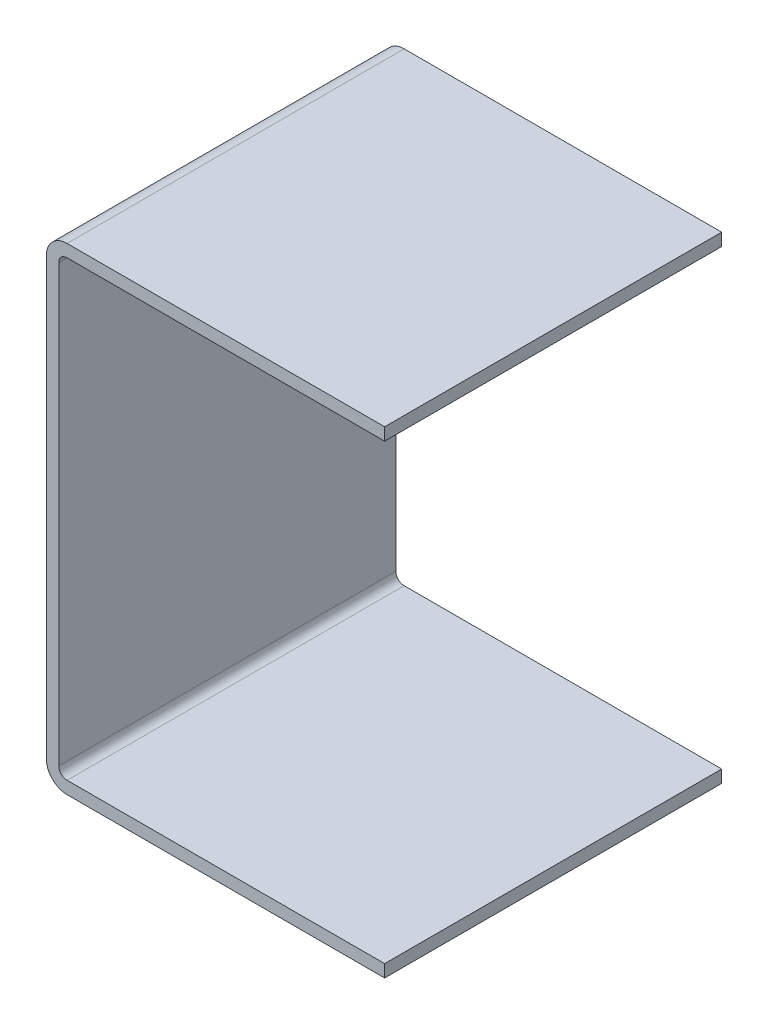
ISO-10303-21;
HEADER;
FILE_DESCRIPTION(('STEP AP214'),'2;1');
FILE_NAME('part.step','',(''),(''),'','','');
FILE_SCHEMA(('AUTOMOTIVE_DESIGN { 1 0 10303 214 1 1 1 1 }'));
ENDSEC;
DATA;
#1=APPLICATION_CONTEXT('core data for automotive mechanical design processes');
#2=APPLICATION_PROTOCOL_DEFINITION('international standard','automotive_design',2000,#1);
#3=PRODUCT_CONTEXT('',#1,'mechanical');
#4=PRODUCT('Part','Part','',(#3));
#5=PRODUCT_RELATED_PRODUCT_CATEGORY('part','',(#4));
#6=PRODUCT_DEFINITION_FORMATION('','',#4);
#7=PRODUCT_DEFINITION_CONTEXT('part definition',#1,'design');
#8=PRODUCT_DEFINITION('design','',#6,#7);
#9=PRODUCT_DEFINITION_SHAPE('','',#8);
#10=(LENGTH_UNIT() NAMED_UNIT(*) SI_UNIT(.MILLI.,.METRE.));
#11=(NAMED_UNIT(*) PLANE_ANGLE_UNIT() SI_UNIT($,.RADIAN.));
#12=(NAMED_UNIT(*) SI_UNIT($,.STERADIAN.) SOLID_ANGLE_UNIT());
#13=UNCERTAINTY_MEASURE_WITH_UNIT(LENGTH_MEASURE(1.E-05),#10,'distance_accuracy_value','');
#14=(GEOMETRIC_REPRESENTATION_CONTEXT(3) GLOBAL_UNCERTAINTY_ASSIGNED_CONTEXT((#13)) GLOBAL_UNIT_ASSIGNED_CONTEXT((#10,
#11,#12)) REPRESENTATION_CONTEXT('',''));
#15=CARTESIAN_POINT('',(0.,0.,0.));
#16=DIRECTION('',(0.,0.,1.));
#17=DIRECTION('',(1.,0.,0.));
#18=AXIS2_PLACEMENT_3D('',#15,#16,#17);
#19=CARTESIAN_POINT('',(-42.5750778056485,-19.4301560758083,40.6));
#20=DIRECTION('',(0.,0.,-1.));
#21=DIRECTION('',(-1.,0.,0.));
#22=AXIS2_PLACEMENT_3D('',#19,#20,#21);
#23=CYLINDRICAL_SURFACE('',#22,5.);
#24=CARTESIAN_POINT('',(-42.5750778056485,-19.4301560758083,-40.6));
#25=DIRECTION('',(0.,0.,1.));
#26=DIRECTION('',(1.,0.,0.));
#27=AXIS2_PLACEMENT_3D('',#24,#25,#26);
#28=CIRCLE('',#27,5.);
#29=CARTESIAN_POINT('',(-47.5750778056485,-19.4301560758082,-40.6));
#30=VERTEX_POINT('',#29);
#31=CARTESIAN_POINT('',(-42.5750778056484,-24.4301560758083,-40.6));
#32=VERTEX_POINT('',#31);
#33=EDGE_CURVE('E151',#30,#32,#28,.T.);
#34=ORIENTED_EDGE('',*,*,#33,.T.);
#35=DIRECTION('',(0.,0.,-1.));
#36=VECTOR('',#35,1.);
#37=CARTESIAN_POINT('',(-42.5750778056484,-24.4301560758083,40.6));
#38=LINE('',#37,#36);
#39=CARTESIAN_POINT('',(-42.5750778056484,-24.4301560758083,40.6));
#40=VERTEX_POINT('',#39);
#41=EDGE_CURVE('E11',#40,#32,#38,.T.);
#42=ORIENTED_EDGE('',*,*,#41,.F.);
#43=CARTESIAN_POINT('',(-42.5750778056485,-19.4301560758083,40.6));
#44=DIRECTION('',(0.,0.,1.));
#45=DIRECTION('',(1.,0.,0.));
#46=AXIS2_PLACEMENT_3D('',#43,#44,#45);
#47=CIRCLE('',#46,5.);
#48=CARTESIAN_POINT('',(-47.5750778056485,-19.4301560758082,40.6));
#49=VERTEX_POINT('',#48);
#50=EDGE_CURVE('E173',#49,#40,#47,.T.);
#51=ORIENTED_EDGE('',*,*,#50,.F.);
#52=DIRECTION('',(0.,0.,-1.));
#53=VECTOR('',#52,1.);
#54=CARTESIAN_POINT('',(-47.5750778056485,-19.4301560758082,40.6));
#55=LINE('',#54,#53);
#56=EDGE_CURVE('E147',#49,#30,#55,.T.);
#57=ORIENTED_EDGE('',*,*,#56,.T.);
#58=EDGE_LOOP('',(#34,#42,#51,#57));
#59=FACE_BOUND('',#58,.T.);
#60=ADVANCED_FACE('F31',(#59),#23,.T.);
#61=CARTESIAN_POINT('',(33.9249221943515,-24.4301560758083,40.6));
#62=DIRECTION('',(0.,1.,0.));
#63=DIRECTION('',(-1.,0.,0.));
#64=AXIS2_PLACEMENT_3D('',#61,#62,#63);
#65=PLANE('',#64);
#66=DIRECTION('',(1.,0.,0.));
#67=VECTOR('',#66,1.);
#68=CARTESIAN_POINT('',(33.9249221943515,-24.4301560758083,-40.6));
#69=LINE('',#68,#67);
#70=CARTESIAN_POINT('',(33.9249221943515,-24.4301560758083,-40.6));
#71=VERTEX_POINT('',#70);
#72=EDGE_CURVE('E154',#32,#71,#69,.T.);
#73=ORIENTED_EDGE('',*,*,#72,.T.);
#74=DIRECTION('',(0.,0.,-1.));
#75=VECTOR('',#74,1.);
#76=CARTESIAN_POINT('',(33.9249221943515,-24.4301560758083,40.6));
#77=LINE('',#76,#75);
#78=CARTESIAN_POINT('',(33.9249221943515,-24.4301560758083,40.6));
#79=VERTEX_POINT('',#78);
#80=EDGE_CURVE('E39',#79,#71,#77,.T.);
#81=ORIENTED_EDGE('',*,*,#80,.F.);
#82=DIRECTION('',(1.,0.,0.));
#83=VECTOR('',#82,1.);
#84=CARTESIAN_POINT('',(33.9249221943515,-24.4301560758083,40.6));
#85=LINE('',#84,#83);
#86=EDGE_CURVE('E102',#40,#79,#85,.T.);
#87=ORIENTED_EDGE('',*,*,#86,.F.);
#88=ORIENTED_EDGE('',*,*,#41,.T.);
#89=EDGE_LOOP('',(#73,#81,#87,#88));
#90=FACE_BOUND('',#89,.T.);
#91=ADVANCED_FACE('F251',(#90),#65,.F.);
#92=CARTESIAN_POINT('',(33.9249221943515,-21.4301560758083,40.6));
#93=DIRECTION('',(-1.,0.,0.));
#94=DIRECTION('',(0.,0.,1.));
#95=AXIS2_PLACEMENT_3D('',#92,#93,#94);
#96=PLANE('',#95);
#97=DIRECTION('',(0.,1.,0.));
#98=VECTOR('',#97,1.);
#99=CARTESIAN_POINT('',(33.9249221943515,-21.4301560758083,-40.6));
#100=LINE('',#99,#98);
#101=CARTESIAN_POINT('',(33.9249221943515,-21.4301560758083,-40.6));
#102=VERTEX_POINT('',#101);
#103=EDGE_CURVE('E156',#71,#102,#100,.T.);
#104=ORIENTED_EDGE('',*,*,#103,.T.);
#105=DIRECTION('',(0.,0.,-1.));
#106=VECTOR('',#105,1.);
#107=CARTESIAN_POINT('',(33.9249221943515,-21.4301560758083,40.6));
#108=LINE('',#107,#106);
#109=CARTESIAN_POINT('',(33.9249221943515,-21.4301560758083,40.6));
#110=VERTEX_POINT('',#109);
#111=EDGE_CURVE('E192',#110,#102,#108,.T.);
#112=ORIENTED_EDGE('',*,*,#111,.F.);
#113=DIRECTION('',(0.,1.,0.));
#114=VECTOR('',#113,1.);
#115=CARTESIAN_POINT('',(33.9249221943515,-21.4301560758083,40.6));
#116=LINE('',#115,#114);
#117=EDGE_CURVE('E200',#79,#110,#116,.T.);
#118=ORIENTED_EDGE('',*,*,#117,.F.);
#119=ORIENTED_EDGE('',*,*,#80,.T.);
#120=EDGE_LOOP('',(#104,#112,#118,#119));
#121=FACE_BOUND('',#120,.T.);
#122=ADVANCED_FACE('F198',(#121),#96,.F.);
#123=CARTESIAN_POINT('',(-42.5750778056484,-21.4301560758082,40.6));
#124=DIRECTION('',(0.,-1.,0.));
#125=DIRECTION('',(1.,0.,0.));
#126=AXIS2_PLACEMENT_3D('',#123,#124,#125);
#127=PLANE('',#126);
#128=DIRECTION('',(-1.,0.,0.));
#129=VECTOR('',#128,1.);
#130=CARTESIAN_POINT('',(-42.5750778056484,-21.4301560758082,-40.6));
#131=LINE('',#130,#129);
#132=CARTESIAN_POINT('',(-42.5750778056484,-21.4301560758082,-40.6));
#133=VERTEX_POINT('',#132);
#134=EDGE_CURVE('E158',#102,#133,#131,.T.);
#135=ORIENTED_EDGE('',*,*,#134,.T.);
#136=DIRECTION('',(0.,0.,-1.));
#137=VECTOR('',#136,1.);
#138=CARTESIAN_POINT('',(-42.5750778056484,-21.4301560758082,40.6));
#139=LINE('',#138,#137);
#140=CARTESIAN_POINT('',(-42.5750778056484,-21.4301560758082,40.6));
#141=VERTEX_POINT('',#140);
#142=EDGE_CURVE('E189',#141,#133,#139,.T.);
#143=ORIENTED_EDGE('',*,*,#142,.F.);
#144=DIRECTION('',(-1.,0.,0.));
#145=VECTOR('',#144,1.);
#146=CARTESIAN_POINT('',(-42.5750778056484,-21.4301560758082,40.6));
#147=LINE('',#146,#145);
#148=EDGE_CURVE('E218',#110,#141,#147,.T.);
#149=ORIENTED_EDGE('',*,*,#148,.F.);
#150=ORIENTED_EDGE('',*,*,#111,.T.);
#151=EDGE_LOOP('',(#135,#143,#149,#150));
#152=FACE_BOUND('',#151,.T.);
#153=ADVANCED_FACE('F209',(#152),#127,.F.);
#154=CARTESIAN_POINT('',(-42.5750778056485,-19.4301560758082,40.6));
#155=DIRECTION('',(0.,0.,-1.));
#156=DIRECTION('',(-1.,0.,0.));
#157=AXIS2_PLACEMENT_3D('',#154,#155,#156);
#158=CYLINDRICAL_SURFACE('',#157,2.);
#159=CARTESIAN_POINT('',(-42.5750778056485,-19.4301560758082,-40.6));
#160=DIRECTION('',(0.,0.,-1.));
#161=DIRECTION('',(1.,0.,0.));
#162=AXIS2_PLACEMENT_3D('',#159,#160,#161);
#163=CIRCLE('',#162,2.);
#164=CARTESIAN_POINT('',(-44.5750778056485,-19.4301560758082,-40.6));
#165=VERTEX_POINT('',#164);
#166=EDGE_CURVE('E160',#133,#165,#163,.T.);
#167=ORIENTED_EDGE('',*,*,#166,.T.);
#168=DIRECTION('',(0.,0.,-1.));
#169=VECTOR('',#168,1.);
#170=CARTESIAN_POINT('',(-44.5750778056485,-19.4301560758082,40.6));
#171=LINE('',#170,#169);
#172=CARTESIAN_POINT('',(-44.5750778056485,-19.4301560758082,40.6));
#173=VERTEX_POINT('',#172);
#174=EDGE_CURVE('E186',#173,#165,#171,.T.);
#175=ORIENTED_EDGE('',*,*,#174,.F.);
#176=CARTESIAN_POINT('',(-42.5750778056485,-19.4301560758082,40.6));
#177=DIRECTION('',(0.,0.,-1.));
#178=DIRECTION('',(1.,0.,0.));
#179=AXIS2_PLACEMENT_3D('',#176,#177,#178);
#180=CIRCLE('',#179,2.);
#181=EDGE_CURVE('E215',#141,#173,#180,.T.);
#182=ORIENTED_EDGE('',*,*,#181,.F.);
#183=ORIENTED_EDGE('',*,*,#142,.T.);
#184=EDGE_LOOP('',(#167,#175,#182,#183));
#185=FACE_BOUND('',#184,.T.);
#186=ADVANCED_FACE('F213',(#185),#158,.F.);
#187=CARTESIAN_POINT('',(-44.5750778056485,85.5698439241917,40.6));
#188=DIRECTION('',(-1.,0.,0.));
#189=DIRECTION('',(0.,-1.,0.));
#190=AXIS2_PLACEMENT_3D('',#187,#188,#189);
#191=PLANE('',#190);
#192=DIRECTION('',(0.,1.,0.));
#193=VECTOR('',#192,1.);
#194=CARTESIAN_POINT('',(-44.5750778056485,85.5698439241917,-40.6));
#195=LINE('',#194,#193);
#196=CARTESIAN_POINT('',(-44.5750778056485,85.5698439241917,-40.6));
#197=VERTEX_POINT('',#196);
#198=EDGE_CURVE('E162',#165,#197,#195,.T.);
#199=ORIENTED_EDGE('',*,*,#198,.T.);
#200=DIRECTION('',(0.,0.,-1.));
#201=VECTOR('',#200,1.);
#202=CARTESIAN_POINT('',(-44.5750778056485,85.5698439241917,40.6));
#203=LINE('',#202,#201);
#204=CARTESIAN_POINT('',(-44.5750778056485,85.5698439241917,40.6));
#205=VERTEX_POINT('',#204);
#206=EDGE_CURVE('E183',#205,#197,#203,.T.);
#207=ORIENTED_EDGE('',*,*,#206,.F.);
#208=DIRECTION('',(0.,1.,0.));
#209=VECTOR('',#208,1.);
#210=CARTESIAN_POINT('',(-44.5750778056485,85.5698439241917,40.6));
#211=LINE('',#210,#209);
#212=EDGE_CURVE('E217',#173,#205,#211,.T.);
#213=ORIENTED_EDGE('',*,*,#212,.F.);
#214=ORIENTED_EDGE('',*,*,#174,.T.);
#215=EDGE_LOOP('',(#199,#207,#213,#214));
#216=FACE_BOUND('',#215,.T.);
#217=ADVANCED_FACE('F264',(#216),#191,.F.);
#218=CARTESIAN_POINT('',(-42.5750778056485,85.5698439241917,40.6));
#219=DIRECTION('',(0.,0.,-1.));
#220=DIRECTION('',(-1.,0.,0.));
#221=AXIS2_PLACEMENT_3D('',#218,#219,#220);
#222=CYLINDRICAL_SURFACE('',#221,2.);
#223=CARTESIAN_POINT('',(-42.5750778056485,85.5698439241917,-40.6));
#224=DIRECTION('',(0.,0.,-1.));
#225=DIRECTION('',(1.,0.,0.));
#226=AXIS2_PLACEMENT_3D('',#223,#224,#225);
#227=CIRCLE('',#226,2.);
#228=CARTESIAN_POINT('',(-42.5750778056485,87.5698439241917,-40.6));
#229=VERTEX_POINT('',#228);
#230=EDGE_CURVE('E164',#197,#229,#227,.T.);
#231=ORIENTED_EDGE('',*,*,#230,.T.);
#232=DIRECTION('',(0.,0.,-1.));
#233=VECTOR('',#232,1.);
#234=CARTESIAN_POINT('',(-42.5750778056485,87.5698439241917,40.6));
#235=LINE('',#234,#233);
#236=CARTESIAN_POINT('',(-42.5750778056485,87.5698439241917,40.6));
#237=VERTEX_POINT('',#236);
#238=EDGE_CURVE('E180',#237,#229,#235,.T.);
#239=ORIENTED_EDGE('',*,*,#238,.F.);
#240=CARTESIAN_POINT('',(-42.5750778056485,85.5698439241917,40.6));
#241=DIRECTION('',(0.,0.,-1.));
#242=DIRECTION('',(1.,0.,0.));
#243=AXIS2_PLACEMENT_3D('',#240,#241,#242);
#244=CIRCLE('',#243,2.);
#245=EDGE_CURVE('E220',#205,#237,#244,.T.);
#246=ORIENTED_EDGE('',*,*,#245,.F.);
#247=ORIENTED_EDGE('',*,*,#206,.T.);
#248=EDGE_LOOP('',(#231,#239,#246,#247));
#249=FACE_BOUND('',#248,.T.);
#250=ADVANCED_FACE('F267',(#249),#222,.F.);
#251=CARTESIAN_POINT('',(33.9249221943515,87.5698439241917,40.6));
#252=DIRECTION('',(0.,1.,0.));
#253=DIRECTION('',(-1.,0.,0.));
#254=AXIS2_PLACEMENT_3D('',#251,#252,#253);
#255=PLANE('',#254);
#256=DIRECTION('',(1.,0.,0.));
#257=VECTOR('',#256,1.);
#258=CARTESIAN_POINT('',(33.9249221943515,87.5698439241917,-40.6));
#259=LINE('',#258,#257);
#260=CARTESIAN_POINT('',(33.9249221943515,87.5698439241917,-40.6));
#261=VERTEX_POINT('',#260);
#262=EDGE_CURVE('E166',#229,#261,#259,.T.);
#263=ORIENTED_EDGE('',*,*,#262,.T.);
#264=DIRECTION('',(0.,0.,-1.));
#265=VECTOR('',#264,1.);
#266=CARTESIAN_POINT('',(33.9249221943515,87.5698439241917,40.6));
#267=LINE('',#266,#265);
#268=CARTESIAN_POINT('',(33.9249221943515,87.5698439241917,40.6));
#269=VERTEX_POINT('',#268);
#270=EDGE_CURVE('E177',#269,#261,#267,.T.);
#271=ORIENTED_EDGE('',*,*,#270,.F.);
#272=DIRECTION('',(1.,0.,0.));
#273=VECTOR('',#272,1.);
#274=CARTESIAN_POINT('',(33.9249221943515,87.5698439241917,40.6));
#275=LINE('',#274,#273);
#276=EDGE_CURVE('E226',#237,#269,#275,.T.);
#277=ORIENTED_EDGE('',*,*,#276,.F.);
#278=ORIENTED_EDGE('',*,*,#238,.T.);
#279=EDGE_LOOP('',(#263,#271,#277,#278));
#280=FACE_BOUND('',#279,.T.);
#281=ADVANCED_FACE('F232',(#280),#255,.F.);
#282=CARTESIAN_POINT('',(33.9249221943515,90.5698439241917,40.6));
#283=DIRECTION('',(-1.,0.,0.));
#284=DIRECTION('',(0.,0.,1.));
#285=AXIS2_PLACEMENT_3D('',#282,#283,#284);
#286=PLANE('',#285);
#287=DIRECTION('',(0.,1.,0.));
#288=VECTOR('',#287,1.);
#289=CARTESIAN_POINT('',(33.9249221943515,90.5698439241917,-40.6));
#290=LINE('',#289,#288);
#291=CARTESIAN_POINT('',(33.9249221943515,90.5698439241917,-40.6));
#292=VERTEX_POINT('',#291);
#293=EDGE_CURVE('E168',#261,#292,#290,.T.);
#294=ORIENTED_EDGE('',*,*,#293,.T.);
#295=DIRECTION('',(0.,0.,-1.));
#296=VECTOR('',#295,1.);
#297=CARTESIAN_POINT('',(33.9249221943515,90.5698439241917,40.6));
#298=LINE('',#297,#296);
#299=CARTESIAN_POINT('',(33.9249221943515,90.5698439241917,40.6));
#300=VERTEX_POINT('',#299);
#301=EDGE_CURVE('E142',#300,#292,#298,.T.);
#302=ORIENTED_EDGE('',*,*,#301,.F.);
#303=DIRECTION('',(0.,1.,0.));
#304=VECTOR('',#303,1.);
#305=CARTESIAN_POINT('',(33.9249221943515,90.5698439241917,40.6));
#306=LINE('',#305,#304);
#307=EDGE_CURVE('E133',#269,#300,#306,.T.);
#308=ORIENTED_EDGE('',*,*,#307,.F.);
#309=ORIENTED_EDGE('',*,*,#270,.T.);
#310=EDGE_LOOP('',(#294,#302,#308,#309));
#311=FACE_BOUND('',#310,.T.);
#312=ADVANCED_FACE('F236',(#311),#286,.F.);
#313=CARTESIAN_POINT('',(-42.5750778056484,90.5698439241917,40.6));
#314=DIRECTION('',(0.,-1.,0.));
#315=DIRECTION('',(0.,0.,-1.));
#316=AXIS2_PLACEMENT_3D('',#313,#314,#315);
#317=PLANE('',#316);
#318=DIRECTION('',(-1.,0.,0.));
#319=VECTOR('',#318,1.);
#320=CARTESIAN_POINT('',(-42.5750778056484,90.5698439241917,-40.6));
#321=LINE('',#320,#319);
#322=CARTESIAN_POINT('',(-42.5750778056484,90.5698439241917,-40.6));
#323=VERTEX_POINT('',#322);
#324=EDGE_CURVE('E141',#292,#323,#321,.T.);
#325=ORIENTED_EDGE('',*,*,#324,.T.);
#326=DIRECTION('',(0.,0.,-1.));
#327=VECTOR('',#326,1.);
#328=CARTESIAN_POINT('',(-42.5750778056484,90.5698439241917,40.6));
#329=LINE('',#328,#327);
#330=CARTESIAN_POINT('',(-42.5750778056484,90.5698439241917,40.6));
#331=VERTEX_POINT('',#330);
#332=EDGE_CURVE('E138',#331,#323,#329,.T.);
#333=ORIENTED_EDGE('',*,*,#332,.F.);
#334=DIRECTION('',(-1.,0.,0.));
#335=VECTOR('',#334,1.);
#336=CARTESIAN_POINT('',(-42.5750778056484,90.5698439241917,40.6));
#337=LINE('',#336,#335);
#338=EDGE_CURVE('E127',#300,#331,#337,.T.);
#339=ORIENTED_EDGE('',*,*,#338,.F.);
#340=ORIENTED_EDGE('',*,*,#301,.T.);
#341=EDGE_LOOP('',(#325,#333,#339,#340));
#342=FACE_BOUND('',#341,.T.);
#343=ADVANCED_FACE('F139',(#342),#317,.F.);
#344=CARTESIAN_POINT('',(-42.5750778056485,85.5698439241917,40.6));
#345=DIRECTION('',(0.,0.,-1.));
#346=DIRECTION('',(-1.,0.,0.));
#347=AXIS2_PLACEMENT_3D('',#344,#345,#346);
#348=CYLINDRICAL_SURFACE('',#347,5.);
#349=CARTESIAN_POINT('',(-42.5750778056485,85.5698439241917,-40.6));
#350=DIRECTION('',(0.,0.,1.));
#351=DIRECTION('',(-1.,0.,0.));
#352=AXIS2_PLACEMENT_3D('',#349,#350,#351);
#353=CIRCLE('',#352,5.);
#354=CARTESIAN_POINT('',(-47.5750778056485,85.5698439241917,-40.6));
#355=VERTEX_POINT('',#354);
#356=EDGE_CURVE('E88',#323,#355,#353,.T.);
#357=ORIENTED_EDGE('',*,*,#356,.T.);
#358=DIRECTION('',(0.,0.,-1.));
#359=VECTOR('',#358,1.);
#360=CARTESIAN_POINT('',(-47.5750778056485,85.5698439241917,40.6));
#361=LINE('',#360,#359);
#362=CARTESIAN_POINT('',(-47.5750778056485,85.5698439241917,40.6));
#363=VERTEX_POINT('',#362);
#364=EDGE_CURVE('E143',#363,#355,#361,.T.);
#365=ORIENTED_EDGE('',*,*,#364,.F.);
#366=CARTESIAN_POINT('',(-42.5750778056485,85.5698439241917,40.6));
#367=DIRECTION('',(0.,0.,1.));
#368=DIRECTION('',(-1.,0.,0.));
#369=AXIS2_PLACEMENT_3D('',#366,#367,#368);
#370=CIRCLE('',#369,5.);
#371=EDGE_CURVE('E131',#331,#363,#370,.T.);
#372=ORIENTED_EDGE('',*,*,#371,.F.);
#373=ORIENTED_EDGE('',*,*,#332,.T.);
#374=EDGE_LOOP('',(#357,#365,#372,#373));
#375=FACE_BOUND('',#374,.T.);
#376=ADVANCED_FACE('F145',(#375),#348,.T.);
#377=CARTESIAN_POINT('',(-47.5750778056485,-19.4301560758082,40.6));
#378=DIRECTION('',(1.,0.,0.));
#379=DIRECTION('',(0.,0.,-1.));
#380=AXIS2_PLACEMENT_3D('',#377,#378,#379);
#381=PLANE('',#380);
#382=DIRECTION('',(0.,-1.,0.));
#383=VECTOR('',#382,1.);
#384=CARTESIAN_POINT('',(-47.5750778056485,-19.4301560758082,-40.6));
#385=LINE('',#384,#383);
#386=EDGE_CURVE('E94',#355,#30,#385,.T.);
#387=ORIENTED_EDGE('',*,*,#386,.T.);
#388=ORIENTED_EDGE('',*,*,#56,.F.);
#389=DIRECTION('',(0.,-1.,0.));
#390=VECTOR('',#389,1.);
#391=CARTESIAN_POINT('',(-47.5750778056485,-19.4301560758082,40.6));
#392=LINE('',#391,#390);
#393=EDGE_CURVE('E47',#363,#49,#392,.T.);
#394=ORIENTED_EDGE('',*,*,#393,.F.);
#395=ORIENTED_EDGE('',*,*,#364,.T.);
#396=EDGE_LOOP('',(#387,#388,#394,#395));
#397=FACE_BOUND('',#396,.T.);
#398=ADVANCED_FACE('F240',(#397),#381,.F.);
#399=CARTESIAN_POINT('',(-42.5750778056485,-19.4301560758083,40.6));
#400=DIRECTION('',(0.,0.,1.));
#401=DIRECTION('',(1.,0.,0.));
#402=AXIS2_PLACEMENT_3D('',#399,#400,#401);
#403=PLANE('',#402);
#404=ORIENTED_EDGE('',*,*,#50,.T.);
#405=ORIENTED_EDGE('',*,*,#86,.T.);
#406=ORIENTED_EDGE('',*,*,#117,.T.);
#407=ORIENTED_EDGE('',*,*,#148,.T.);
#408=ORIENTED_EDGE('',*,*,#181,.T.);
#409=ORIENTED_EDGE('',*,*,#212,.T.);
#410=ORIENTED_EDGE('',*,*,#245,.T.);
#411=ORIENTED_EDGE('',*,*,#276,.T.);
#412=ORIENTED_EDGE('',*,*,#307,.T.);
#413=ORIENTED_EDGE('',*,*,#338,.T.);
#414=ORIENTED_EDGE('',*,*,#371,.T.);
#415=ORIENTED_EDGE('',*,*,#393,.T.);
#416=EDGE_LOOP('',(#404,#405,#406,#407,#408,#409,#410,#411,#412,#413,#414,#415));
#417=FACE_BOUND('',#416,.T.);
#418=ADVANCED_FACE('F129',(#417),#403,.T.);
#419=CARTESIAN_POINT('',(-42.5750778056485,-19.4301560758083,-40.6));
#420=DIRECTION('',(0.,0.,1.));
#421=DIRECTION('',(1.,0.,0.));
#422=AXIS2_PLACEMENT_3D('',#419,#420,#421);
#423=PLANE('',#422);
#424=ORIENTED_EDGE('',*,*,#33,.F.);
#425=ORIENTED_EDGE('',*,*,#386,.F.);
#426=ORIENTED_EDGE('',*,*,#356,.F.);
#427=ORIENTED_EDGE('',*,*,#324,.F.);
#428=ORIENTED_EDGE('',*,*,#293,.F.);
#429=ORIENTED_EDGE('',*,*,#262,.F.);
#430=ORIENTED_EDGE('',*,*,#230,.F.);
#431=ORIENTED_EDGE('',*,*,#198,.F.);
#432=ORIENTED_EDGE('',*,*,#166,.F.);
#433=ORIENTED_EDGE('',*,*,#134,.F.);
#434=ORIENTED_EDGE('',*,*,#103,.F.);
#435=ORIENTED_EDGE('',*,*,#72,.F.);
#436=EDGE_LOOP('',(#424,#425,#426,#427,#428,#429,#430,#431,#432,#433,#434,#435));
#437=FACE_BOUND('',#436,.T.);
#438=ADVANCED_FACE('F204',(#437),#423,.F.);
#439=CLOSED_SHELL('',(#60,#91,#122,#153,#186,#217,#250,#281,#312,#343,#376,#398,#418,#438));
#440=MANIFOLD_SOLID_BREP('B2',#439);
#441=ADVANCED_BREP_SHAPE_REPRESENTATION('',(#18,#440),#14);
#442=SHAPE_DEFINITION_REPRESENTATION(#9,#441);
ENDSEC;
END-ISO-10303-21;
